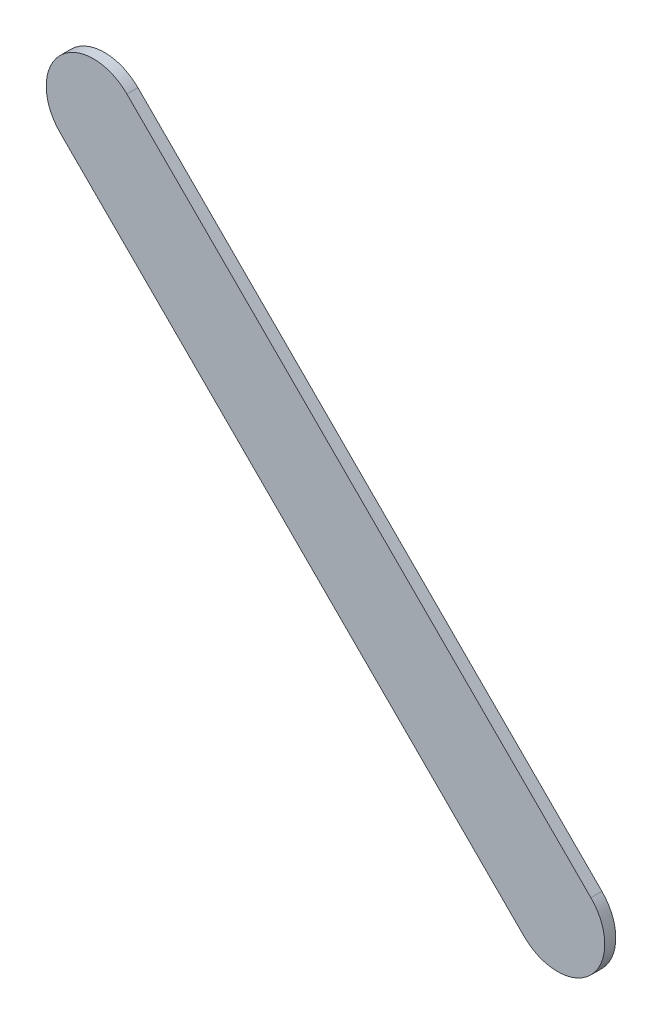
ISO-10303-21;
HEADER;
FILE_DESCRIPTION(('STEP AP214'),'2;1');
FILE_NAME('part.step','',(''),(''),'','','');
FILE_SCHEMA(('AUTOMOTIVE_DESIGN { 1 0 10303 214 1 1 1 1 }'));
ENDSEC;
DATA;
#1=APPLICATION_CONTEXT('core data for automotive mechanical design processes');
#2=APPLICATION_PROTOCOL_DEFINITION('international standard','automotive_design',2000,#1);
#3=PRODUCT_CONTEXT('',#1,'mechanical');
#4=PRODUCT('Part','Part','',(#3));
#5=PRODUCT_RELATED_PRODUCT_CATEGORY('part','',(#4));
#6=PRODUCT_DEFINITION_FORMATION('','',#4);
#7=PRODUCT_DEFINITION_CONTEXT('part definition',#1,'design');
#8=PRODUCT_DEFINITION('design','',#6,#7);
#9=PRODUCT_DEFINITION_SHAPE('','',#8);
#10=(LENGTH_UNIT() NAMED_UNIT(*) SI_UNIT(.MILLI.,.METRE.));
#11=(NAMED_UNIT(*) PLANE_ANGLE_UNIT() SI_UNIT($,.RADIAN.));
#12=(NAMED_UNIT(*) SI_UNIT($,.STERADIAN.) SOLID_ANGLE_UNIT());
#13=UNCERTAINTY_MEASURE_WITH_UNIT(LENGTH_MEASURE(1.E-05),#10,'distance_accuracy_value','');
#14=(GEOMETRIC_REPRESENTATION_CONTEXT(3) GLOBAL_UNCERTAINTY_ASSIGNED_CONTEXT((#13)) GLOBAL_UNIT_ASSIGNED_CONTEXT((#10,
#11,#12)) REPRESENTATION_CONTEXT('',''));
#15=CARTESIAN_POINT('',(0.,0.,0.));
#16=DIRECTION('',(0.,0.,1.));
#17=DIRECTION('',(1.,0.,0.));
#18=AXIS2_PLACEMENT_3D('',#15,#16,#17);
#19=CARTESIAN_POINT('',(84.093933,-126.856066,1.635));
#20=DIRECTION('',(0.,0.,1.));
#21=DIRECTION('',(1.,0.,0.));
#22=AXIS2_PLACEMENT_3D('',#19,#20,#21);
#23=PLANE('',#22);
#24=DIRECTION('',(0.707106781186548,-0.707106781186548,0.));
#25=VECTOR('',#24,1.);
#26=CARTESIAN_POINT('',(84.093933,-126.856066,1.635));
#27=LINE('',#26,#25);
#28=CARTESIAN_POINT('',(84.093933,-126.856066,1.635));
#29=VERTEX_POINT('',#28);
#30=CARTESIAN_POINT('',(85.566469,-128.328602,1.635));
#31=VERTEX_POINT('',#30);
#32=EDGE_CURVE('E83',#29,#31,#27,.T.);
#33=ORIENTED_EDGE('',*,*,#32,.T.);
#34=CARTESIAN_POINT('',(85.6725355,-128.2225355,1.635));
#35=DIRECTION('',(0.,0.,1.));
#36=DIRECTION('',(-0.707106781186548,-0.707106781186548,0.));
#37=AXIS2_PLACEMENT_3D('',#34,#35,#36);
#38=CIRCLE('',#37,0.150000682813);
#39=CARTESIAN_POINT('',(85.778602,-128.116469,1.635));
#40=VERTEX_POINT('',#39);
#41=EDGE_CURVE('E104',#31,#40,#38,.T.);
#42=ORIENTED_EDGE('',*,*,#41,.T.);
#43=DIRECTION('',(-0.707106781186548,0.707106781186548,0.));
#44=VECTOR('',#43,1.);
#45=CARTESIAN_POINT('',(85.778602,-128.116469,1.635));
#46=LINE('',#45,#44);
#47=CARTESIAN_POINT('',(84.306066,-126.643933,1.635));
#48=VERTEX_POINT('',#47);
#49=EDGE_CURVE('E76',#40,#48,#46,.T.);
#50=ORIENTED_EDGE('',*,*,#49,.T.);
#51=CARTESIAN_POINT('',(84.1999995,-126.7499995,1.635));
#52=DIRECTION('',(0.,0.,1.));
#53=DIRECTION('',(0.707106781186548,0.707106781186548,0.));
#54=AXIS2_PLACEMENT_3D('',#51,#52,#53);
#55=CIRCLE('',#54,0.150000682813);
#56=EDGE_CURVE('E11',#48,#29,#55,.T.);
#57=ORIENTED_EDGE('',*,*,#56,.T.);
#58=EDGE_LOOP('',(#33,#42,#50,#57));
#59=FACE_BOUND('',#58,.T.);
#60=ADVANCED_FACE('F17',(#59),#23,.T.);
#61=CARTESIAN_POINT('',(84.093933,-126.856066,1.6));
#62=DIRECTION('',(0.,0.,1.));
#63=DIRECTION('',(1.,0.,0.));
#64=AXIS2_PLACEMENT_3D('',#61,#62,#63);
#65=PLANE('',#64);
#66=CARTESIAN_POINT('',(84.1999995,-126.7499995,1.6));
#67=DIRECTION('',(0.,0.,1.));
#68=DIRECTION('',(0.707106781186548,0.707106781186548,0.));
#69=AXIS2_PLACEMENT_3D('',#66,#67,#68);
#70=CIRCLE('',#69,0.150000682813);
#71=CARTESIAN_POINT('',(84.306066,-126.643933,1.6));
#72=VERTEX_POINT('',#71);
#73=CARTESIAN_POINT('',(84.093933,-126.856066,1.6));
#74=VERTEX_POINT('',#73);
#75=EDGE_CURVE('E21',#72,#74,#70,.T.);
#76=ORIENTED_EDGE('',*,*,#75,.F.);
#77=DIRECTION('',(-0.707106781186548,0.707106781186548,0.));
#78=VECTOR('',#77,1.);
#79=CARTESIAN_POINT('',(85.778602,-128.116469,1.6));
#80=LINE('',#79,#78);
#81=CARTESIAN_POINT('',(85.778602,-128.116469,1.6));
#82=VERTEX_POINT('',#81);
#83=EDGE_CURVE('E110',#82,#72,#80,.T.);
#84=ORIENTED_EDGE('',*,*,#83,.F.);
#85=CARTESIAN_POINT('',(85.6725355,-128.2225355,1.6));
#86=DIRECTION('',(0.,0.,1.));
#87=DIRECTION('',(-0.707106781186548,-0.707106781186548,0.));
#88=AXIS2_PLACEMENT_3D('',#85,#86,#87);
#89=CIRCLE('',#88,0.150000682813);
#90=CARTESIAN_POINT('',(85.566469,-128.328602,1.6));
#91=VERTEX_POINT('',#90);
#92=EDGE_CURVE('E85',#91,#82,#89,.T.);
#93=ORIENTED_EDGE('',*,*,#92,.F.);
#94=DIRECTION('',(0.707106781186548,-0.707106781186548,0.));
#95=VECTOR('',#94,1.);
#96=CARTESIAN_POINT('',(84.093933,-126.856066,1.6));
#97=LINE('',#96,#95);
#98=EDGE_CURVE('E81',#74,#91,#97,.T.);
#99=ORIENTED_EDGE('',*,*,#98,.F.);
#100=EDGE_LOOP('',(#76,#84,#93,#99));
#101=FACE_BOUND('',#100,.T.);
#102=ADVANCED_FACE('F19',(#101),#65,.F.);
#103=CARTESIAN_POINT('',(84.1999995,-126.7499995,1.6));
#104=DIRECTION('',(0.,0.,-1.));
#105=DIRECTION('',(0.707106781186548,0.707106781186548,0.));
#106=AXIS2_PLACEMENT_3D('',#103,#104,#105);
#107=CYLINDRICAL_SURFACE('',#106,0.150000682813);
#108=ORIENTED_EDGE('',*,*,#75,.T.);
#109=DIRECTION('',(0.,0.,1.));
#110=VECTOR('',#109,1.);
#111=CARTESIAN_POINT('',(84.093933,-126.856066,1.6));
#112=LINE('',#111,#110);
#113=EDGE_CURVE('E70',#74,#29,#112,.T.);
#114=ORIENTED_EDGE('',*,*,#113,.T.);
#115=ORIENTED_EDGE('',*,*,#56,.F.);
#116=DIRECTION('',(0.,0.,1.));
#117=VECTOR('',#116,1.);
#118=CARTESIAN_POINT('',(84.306066,-126.643933,1.6));
#119=LINE('',#118,#117);
#120=EDGE_CURVE('E73',#72,#48,#119,.T.);
#121=ORIENTED_EDGE('',*,*,#120,.F.);
#122=EDGE_LOOP('',(#108,#114,#115,#121));
#123=FACE_BOUND('',#122,.T.);
#124=ADVANCED_FACE('F69',(#123),#107,.T.);
#125=CARTESIAN_POINT('',(85.778602,-128.116469,1.6));
#126=DIRECTION('',(-0.707106781186548,-0.707106781186548,0.));
#127=DIRECTION('',(-0.707106781186548,0.707106781186548,0.));
#128=AXIS2_PLACEMENT_3D('',#125,#126,#127);
#129=PLANE('',#128);
#130=ORIENTED_EDGE('',*,*,#83,.T.);
#131=ORIENTED_EDGE('',*,*,#120,.T.);
#132=ORIENTED_EDGE('',*,*,#49,.F.);
#133=DIRECTION('',(0.,0.,1.));
#134=VECTOR('',#133,1.);
#135=CARTESIAN_POINT('',(85.778602,-128.116469,1.6));
#136=LINE('',#135,#134);
#137=EDGE_CURVE('E100',#82,#40,#136,.T.);
#138=ORIENTED_EDGE('',*,*,#137,.F.);
#139=EDGE_LOOP('',(#130,#131,#132,#138));
#140=FACE_BOUND('',#139,.T.);
#141=ADVANCED_FACE('F120',(#140),#129,.F.);
#142=CARTESIAN_POINT('',(85.6725355,-128.2225355,1.6));
#143=DIRECTION('',(0.,0.,-1.));
#144=DIRECTION('',(-0.707106781186548,-0.707106781186548,0.));
#145=AXIS2_PLACEMENT_3D('',#142,#143,#144);
#146=CYLINDRICAL_SURFACE('',#145,0.150000682813);
#147=ORIENTED_EDGE('',*,*,#92,.T.);
#148=ORIENTED_EDGE('',*,*,#137,.T.);
#149=ORIENTED_EDGE('',*,*,#41,.F.);
#150=DIRECTION('',(0.,0.,1.));
#151=VECTOR('',#150,1.);
#152=CARTESIAN_POINT('',(85.566469,-128.328602,1.6));
#153=LINE('',#152,#151);
#154=EDGE_CURVE('E90',#91,#31,#153,.T.);
#155=ORIENTED_EDGE('',*,*,#154,.F.);
#156=EDGE_LOOP('',(#147,#148,#149,#155));
#157=FACE_BOUND('',#156,.T.);
#158=ADVANCED_FACE('F122',(#157),#146,.T.);
#159=CARTESIAN_POINT('',(84.093933,-126.856066,1.6));
#160=DIRECTION('',(0.707106781186548,0.707106781186548,0.));
#161=DIRECTION('',(0.,0.,-1.));
#162=AXIS2_PLACEMENT_3D('',#159,#160,#161);
#163=PLANE('',#162);
#164=ORIENTED_EDGE('',*,*,#98,.T.);
#165=ORIENTED_EDGE('',*,*,#154,.T.);
#166=ORIENTED_EDGE('',*,*,#32,.F.);
#167=ORIENTED_EDGE('',*,*,#113,.F.);
#168=EDGE_LOOP('',(#164,#165,#166,#167));
#169=FACE_BOUND('',#168,.T.);
#170=ADVANCED_FACE('F79',(#169),#163,.F.);
#171=CLOSED_SHELL('',(#60,#102,#124,#141,#158,#170));
#172=MANIFOLD_SOLID_BREP('B1',#171);
#173=ADVANCED_BREP_SHAPE_REPRESENTATION('',(#18,#172),#14);
#174=SHAPE_DEFINITION_REPRESENTATION(#9,#173);
ENDSEC;
END-ISO-10303-21;
